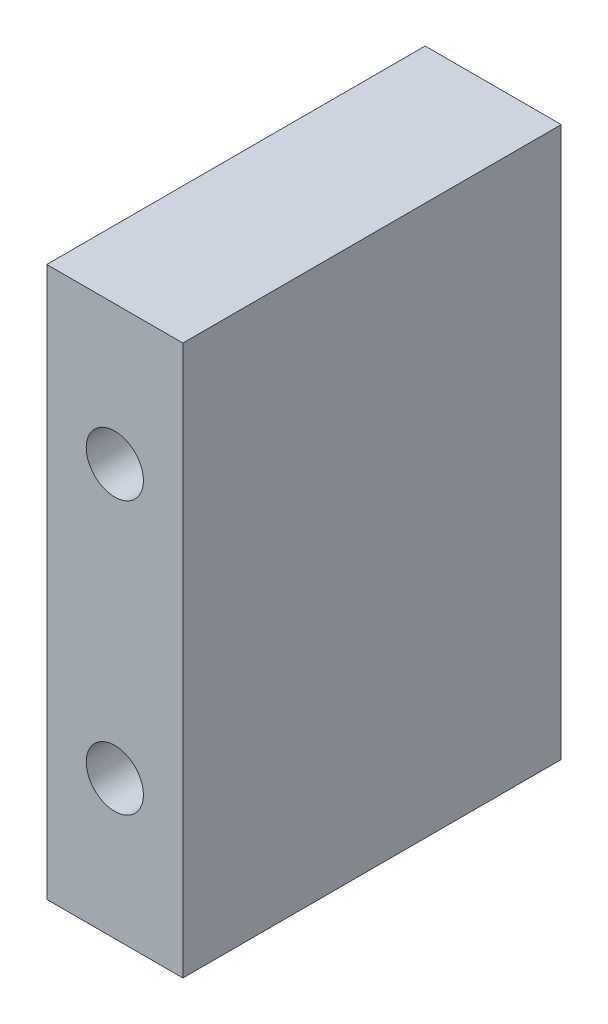
ISO-10303-21;
HEADER;
FILE_DESCRIPTION(('STEP AP214'),'2;1');
FILE_NAME('part.step','',(''),(''),'','','');
FILE_SCHEMA(('AUTOMOTIVE_DESIGN { 1 0 10303 214 1 1 1 1 }'));
ENDSEC;
DATA;
#1=APPLICATION_CONTEXT('core data for automotive mechanical design processes');
#2=APPLICATION_PROTOCOL_DEFINITION('international standard','automotive_design',2000,#1);
#3=PRODUCT_CONTEXT('',#1,'mechanical');
#4=PRODUCT('Part','Part','',(#3));
#5=PRODUCT_RELATED_PRODUCT_CATEGORY('part','',(#4));
#6=PRODUCT_DEFINITION_FORMATION('','',#4);
#7=PRODUCT_DEFINITION_CONTEXT('part definition',#1,'design');
#8=PRODUCT_DEFINITION('design','',#6,#7);
#9=PRODUCT_DEFINITION_SHAPE('','',#8);
#10=(LENGTH_UNIT() NAMED_UNIT(*) SI_UNIT(.MILLI.,.METRE.));
#11=(NAMED_UNIT(*) PLANE_ANGLE_UNIT() SI_UNIT($,.RADIAN.));
#12=(NAMED_UNIT(*) SI_UNIT($,.STERADIAN.) SOLID_ANGLE_UNIT());
#13=UNCERTAINTY_MEASURE_WITH_UNIT(LENGTH_MEASURE(1.E-05),#10,'distance_accuracy_value','');
#14=(GEOMETRIC_REPRESENTATION_CONTEXT(3) GLOBAL_UNCERTAINTY_ASSIGNED_CONTEXT((#13)) GLOBAL_UNIT_ASSIGNED_CONTEXT((#10,
#11,#12)) REPRESENTATION_CONTEXT('',''));
#15=CARTESIAN_POINT('',(0.,0.,0.));
#16=DIRECTION('',(0.,0.,1.));
#17=DIRECTION('',(1.,0.,0.));
#18=AXIS2_PLACEMENT_3D('',#15,#16,#17);
#19=CARTESIAN_POINT('',(2.5,10.1,13.9));
#20=DIRECTION('',(-1.,0.,0.));
#21=DIRECTION('',(0.,-1.,0.));
#22=AXIS2_PLACEMENT_3D('',#19,#20,#21);
#23=PLANE('',#22);
#24=DIRECTION('',(0.,1.,0.));
#25=VECTOR('',#24,1.);
#26=CARTESIAN_POINT('',(2.5,10.1,0.));
#27=LINE('',#26,#25);
#28=CARTESIAN_POINT('',(2.5,-10.1,0.));
#29=VERTEX_POINT('',#28);
#30=CARTESIAN_POINT('',(2.5,10.1,0.));
#31=VERTEX_POINT('',#30);
#32=EDGE_CURVE('E107',#29,#31,#27,.T.);
#33=ORIENTED_EDGE('',*,*,#32,.T.);
#34=DIRECTION('',(0.,0.,-1.));
#35=VECTOR('',#34,1.);
#36=CARTESIAN_POINT('',(2.5,10.1,13.9));
#37=LINE('',#36,#35);
#38=CARTESIAN_POINT('',(2.5,10.1,13.9));
#39=VERTEX_POINT('',#38);
#40=EDGE_CURVE('E11',#39,#31,#37,.T.);
#41=ORIENTED_EDGE('',*,*,#40,.F.);
#42=DIRECTION('',(0.,1.,0.));
#43=VECTOR('',#42,1.);
#44=CARTESIAN_POINT('',(2.5,10.1,13.9));
#45=LINE('',#44,#43);
#46=CARTESIAN_POINT('',(2.5,-10.1,13.9));
#47=VERTEX_POINT('',#46);
#48=EDGE_CURVE('E91',#47,#39,#45,.T.);
#49=ORIENTED_EDGE('',*,*,#48,.F.);
#50=DIRECTION('',(0.,0.,-1.));
#51=VECTOR('',#50,1.);
#52=CARTESIAN_POINT('',(2.5,-10.1,13.9));
#53=LINE('',#52,#51);
#54=EDGE_CURVE('E103',#47,#29,#53,.T.);
#55=ORIENTED_EDGE('',*,*,#54,.T.);
#56=EDGE_LOOP('',(#33,#41,#49,#55));
#57=FACE_BOUND('',#56,.T.);
#58=ADVANCED_FACE('F39',(#57),#23,.F.);
#59=CARTESIAN_POINT('',(-2.5,10.1,13.9));
#60=DIRECTION('',(0.,-1.,0.));
#61=DIRECTION('',(0.,0.,-1.));
#62=AXIS2_PLACEMENT_3D('',#59,#60,#61);
#63=PLANE('',#62);
#64=DIRECTION('',(-1.,0.,0.));
#65=VECTOR('',#64,1.);
#66=CARTESIAN_POINT('',(-2.5,10.1,0.));
#67=LINE('',#66,#65);
#68=CARTESIAN_POINT('',(-2.5,10.1,0.));
#69=VERTEX_POINT('',#68);
#70=EDGE_CURVE('E96',#31,#69,#67,.T.);
#71=ORIENTED_EDGE('',*,*,#70,.T.);
#72=DIRECTION('',(0.,0.,-1.));
#73=VECTOR('',#72,1.);
#74=CARTESIAN_POINT('',(-2.5,10.1,13.9));
#75=LINE('',#74,#73);
#76=CARTESIAN_POINT('',(-2.5,10.1,13.9));
#77=VERTEX_POINT('',#76);
#78=EDGE_CURVE('E48',#77,#69,#75,.T.);
#79=ORIENTED_EDGE('',*,*,#78,.F.);
#80=DIRECTION('',(-1.,0.,0.));
#81=VECTOR('',#80,1.);
#82=CARTESIAN_POINT('',(-2.5,10.1,13.9));
#83=LINE('',#82,#81);
#84=EDGE_CURVE('E86',#39,#77,#83,.T.);
#85=ORIENTED_EDGE('',*,*,#84,.F.);
#86=ORIENTED_EDGE('',*,*,#40,.T.);
#87=EDGE_LOOP('',(#71,#79,#85,#86));
#88=FACE_BOUND('',#87,.T.);
#89=ADVANCED_FACE('F95',(#88),#63,.F.);
#90=CARTESIAN_POINT('',(-2.5,10.1,13.9));
#91=DIRECTION('',(1.,0.,0.));
#92=DIRECTION('',(0.,1.,0.));
#93=AXIS2_PLACEMENT_3D('',#90,#91,#92);
#94=PLANE('',#93);
#95=DIRECTION('',(0.,-1.,0.));
#96=VECTOR('',#95,1.);
#97=CARTESIAN_POINT('',(-2.5,10.1,0.));
#98=LINE('',#97,#96);
#99=CARTESIAN_POINT('',(-2.5,-10.1,0.));
#100=VERTEX_POINT('',#99);
#101=EDGE_CURVE('E73',#69,#100,#98,.T.);
#102=ORIENTED_EDGE('',*,*,#101,.T.);
#103=DIRECTION('',(0.,0.,-1.));
#104=VECTOR('',#103,1.);
#105=CARTESIAN_POINT('',(-2.5,-10.1,13.9));
#106=LINE('',#105,#104);
#107=CARTESIAN_POINT('',(-2.5,-10.1,13.9));
#108=VERTEX_POINT('',#107);
#109=EDGE_CURVE('E98',#108,#100,#106,.T.);
#110=ORIENTED_EDGE('',*,*,#109,.F.);
#111=DIRECTION('',(0.,-1.,0.));
#112=VECTOR('',#111,1.);
#113=CARTESIAN_POINT('',(-2.5,10.1,13.9));
#114=LINE('',#113,#112);
#115=EDGE_CURVE('E89',#77,#108,#114,.T.);
#116=ORIENTED_EDGE('',*,*,#115,.F.);
#117=ORIENTED_EDGE('',*,*,#78,.T.);
#118=EDGE_LOOP('',(#102,#110,#116,#117));
#119=FACE_BOUND('',#118,.T.);
#120=ADVANCED_FACE('F99',(#119),#94,.F.);
#121=CARTESIAN_POINT('',(-2.5,-10.1,13.9));
#122=DIRECTION('',(0.,1.,0.));
#123=DIRECTION('',(0.,0.,1.));
#124=AXIS2_PLACEMENT_3D('',#121,#122,#123);
#125=PLANE('',#124);
#126=DIRECTION('',(1.,0.,0.));
#127=VECTOR('',#126,1.);
#128=CARTESIAN_POINT('',(-2.5,-10.1,0.));
#129=LINE('',#128,#127);
#130=EDGE_CURVE('E79',#100,#29,#129,.T.);
#131=ORIENTED_EDGE('',*,*,#130,.T.);
#132=ORIENTED_EDGE('',*,*,#54,.F.);
#133=DIRECTION('',(1.,0.,0.));
#134=VECTOR('',#133,1.);
#135=CARTESIAN_POINT('',(-2.5,-10.1,13.9));
#136=LINE('',#135,#134);
#137=EDGE_CURVE('E56',#108,#47,#136,.T.);
#138=ORIENTED_EDGE('',*,*,#137,.F.);
#139=ORIENTED_EDGE('',*,*,#109,.T.);
#140=EDGE_LOOP('',(#131,#132,#138,#139));
#141=FACE_BOUND('',#140,.T.);
#142=ADVANCED_FACE('F121',(#141),#125,.F.);
#143=CARTESIAN_POINT('',(0.,0.,13.9));
#144=DIRECTION('',(0.,0.,1.));
#145=DIRECTION('',(1.,0.,0.));
#146=AXIS2_PLACEMENT_3D('',#143,#144,#145);
#147=PLANE('',#146);
#148=CARTESIAN_POINT('',(0.,5.,13.9));
#149=DIRECTION('',(0.,0.,-1.));
#150=DIRECTION('',(-1.,0.,0.));
#151=AXIS2_PLACEMENT_3D('',#148,#149,#150);
#152=CIRCLE('',#151,1.05);
#153=CARTESIAN_POINT('',(-1.05,5.,13.9));
#154=VERTEX_POINT('',#153);
#155=EDGE_CURVE('E111',#154,#154,#152,.T.);
#156=ORIENTED_EDGE('',*,*,#155,.T.);
#157=EDGE_LOOP('',(#156));
#158=FACE_BOUND('',#157,.T.);
#159=CARTESIAN_POINT('',(-1.03877078427306E-13,-5.,13.9));
#160=DIRECTION('',(0.,0.,-1.));
#161=DIRECTION('',(-1.,0.,0.));
#162=AXIS2_PLACEMENT_3D('',#159,#160,#161);
#163=CIRCLE('',#162,1.05);
#164=CARTESIAN_POINT('',(-1.0500000000001,-5.,13.9));
#165=VERTEX_POINT('',#164);
#166=EDGE_CURVE('E132',#165,#165,#163,.T.);
#167=ORIENTED_EDGE('',*,*,#166,.T.);
#168=EDGE_LOOP('',(#167));
#169=FACE_BOUND('',#168,.T.);
#170=ORIENTED_EDGE('',*,*,#48,.T.);
#171=ORIENTED_EDGE('',*,*,#84,.T.);
#172=ORIENTED_EDGE('',*,*,#115,.T.);
#173=ORIENTED_EDGE('',*,*,#137,.T.);
#174=EDGE_LOOP('',(#170,#171,#172,#173));
#175=FACE_BOUND('',#174,.T.);
#176=ADVANCED_FACE('F87',(#158,#169,#175),#147,.T.);
#177=CARTESIAN_POINT('',(0.,0.,0.));
#178=DIRECTION('',(0.,0.,1.));
#179=DIRECTION('',(1.,0.,0.));
#180=AXIS2_PLACEMENT_3D('',#177,#178,#179);
#181=PLANE('',#180);
#182=CARTESIAN_POINT('',(0.,5.,0.));
#183=DIRECTION('',(0.,0.,-1.));
#184=DIRECTION('',(-1.,0.,0.));
#185=AXIS2_PLACEMENT_3D('',#182,#183,#184);
#186=CIRCLE('',#185,1.05);
#187=CARTESIAN_POINT('',(-1.05,5.,0.));
#188=VERTEX_POINT('',#187);
#189=EDGE_CURVE('E136',#188,#188,#186,.T.);
#190=ORIENTED_EDGE('',*,*,#189,.F.);
#191=EDGE_LOOP('',(#190));
#192=FACE_BOUND('',#191,.T.);
#193=CARTESIAN_POINT('',(-1.03877078427306E-13,-5.,0.));
#194=DIRECTION('',(0.,0.,-1.));
#195=DIRECTION('',(-1.,0.,0.));
#196=AXIS2_PLACEMENT_3D('',#193,#194,#195);
#197=CIRCLE('',#196,1.05);
#198=CARTESIAN_POINT('',(-1.0500000000001,-5.,0.));
#199=VERTEX_POINT('',#198);
#200=EDGE_CURVE('E128',#199,#199,#197,.T.);
#201=ORIENTED_EDGE('',*,*,#200,.F.);
#202=EDGE_LOOP('',(#201));
#203=FACE_BOUND('',#202,.T.);
#204=ORIENTED_EDGE('',*,*,#32,.F.);
#205=ORIENTED_EDGE('',*,*,#130,.F.);
#206=ORIENTED_EDGE('',*,*,#101,.F.);
#207=ORIENTED_EDGE('',*,*,#70,.F.);
#208=EDGE_LOOP('',(#204,#205,#206,#207));
#209=FACE_BOUND('',#208,.T.);
#210=ADVANCED_FACE('F124',(#192,#203,#209),#181,.F.);
#211=CARTESIAN_POINT('',(-1.03877078427306E-13,-5.,13.9));
#212=DIRECTION('',(0.,0.,-1.));
#213=DIRECTION('',(-1.,0.,0.));
#214=AXIS2_PLACEMENT_3D('',#211,#212,#213);
#215=CYLINDRICAL_SURFACE('',#214,1.05);
#216=ORIENTED_EDGE('',*,*,#166,.F.);
#217=EDGE_LOOP('',(#216));
#218=FACE_BOUND('',#217,.T.);
#219=ORIENTED_EDGE('',*,*,#200,.T.);
#220=EDGE_LOOP('',(#219));
#221=FACE_BOUND('',#220,.T.);
#222=ADVANCED_FACE('F149',(#218,#221),#215,.F.);
#223=CARTESIAN_POINT('',(0.,5.,13.9));
#224=DIRECTION('',(0.,0.,-1.));
#225=DIRECTION('',(-1.,0.,0.));
#226=AXIS2_PLACEMENT_3D('',#223,#224,#225);
#227=CYLINDRICAL_SURFACE('',#226,1.05);
#228=ORIENTED_EDGE('',*,*,#155,.F.);
#229=EDGE_LOOP('',(#228));
#230=FACE_BOUND('',#229,.T.);
#231=ORIENTED_EDGE('',*,*,#189,.T.);
#232=EDGE_LOOP('',(#231));
#233=FACE_BOUND('',#232,.T.);
#234=ADVANCED_FACE('F146',(#230,#233),#227,.F.);
#235=CLOSED_SHELL('',(#58,#89,#120,#142,#176,#210,#222,#234));
#236=MANIFOLD_SOLID_BREP('B2',#235);
#237=ADVANCED_BREP_SHAPE_REPRESENTATION('',(#18,#236),#14);
#238=SHAPE_DEFINITION_REPRESENTATION(#9,#237);
ENDSEC;
END-ISO-10303-21;
